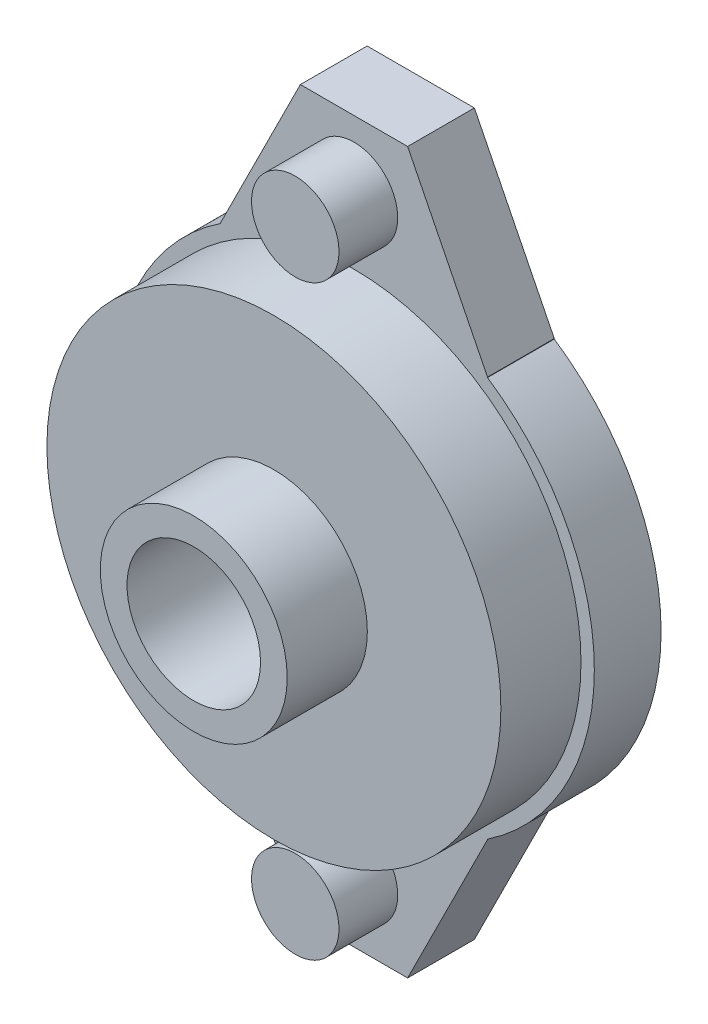
ISO-10303-21;
HEADER;
FILE_DESCRIPTION(('STEP AP214'),'2;1');
FILE_NAME('part.step','',(''),(''),'','','');
FILE_SCHEMA(('AUTOMOTIVE_DESIGN { 1 0 10303 214 1 1 1 1 }'));
ENDSEC;
DATA;
#1=APPLICATION_CONTEXT('core data for automotive mechanical design processes');
#2=APPLICATION_PROTOCOL_DEFINITION('international standard','automotive_design',2000,#1);
#3=PRODUCT_CONTEXT('',#1,'mechanical');
#4=PRODUCT('Part','Part','',(#3));
#5=PRODUCT_RELATED_PRODUCT_CATEGORY('part','',(#4));
#6=PRODUCT_DEFINITION_FORMATION('','',#4);
#7=PRODUCT_DEFINITION_CONTEXT('part definition',#1,'design');
#8=PRODUCT_DEFINITION('design','',#6,#7);
#9=PRODUCT_DEFINITION_SHAPE('','',#8);
#10=(LENGTH_UNIT() NAMED_UNIT(*) SI_UNIT(.MILLI.,.METRE.));
#11=(NAMED_UNIT(*) PLANE_ANGLE_UNIT() SI_UNIT($,.RADIAN.));
#12=(NAMED_UNIT(*) SI_UNIT($,.STERADIAN.) SOLID_ANGLE_UNIT());
#13=UNCERTAINTY_MEASURE_WITH_UNIT(LENGTH_MEASURE(1.E-05),#10,'distance_accuracy_value','');
#14=(GEOMETRIC_REPRESENTATION_CONTEXT(3) GLOBAL_UNCERTAINTY_ASSIGNED_CONTEXT((#13)) GLOBAL_UNIT_ASSIGNED_CONTEXT((#10,
#11,#12)) REPRESENTATION_CONTEXT('',''));
#15=CARTESIAN_POINT('',(0.,0.,0.));
#16=DIRECTION('',(0.,0.,1.));
#17=DIRECTION('',(1.,0.,0.));
#18=AXIS2_PLACEMENT_3D('',#15,#16,#17);
#19=CARTESIAN_POINT('',(0.,0.,-5.));
#20=DIRECTION('',(0.,0.,-1.));
#21=DIRECTION('',(-1.,0.,0.));
#22=AXIS2_PLACEMENT_3D('',#19,#20,#21);
#23=PLANE('',#22);
#24=CARTESIAN_POINT('',(0.,0.,-5.));
#25=DIRECTION('',(0.,0.,1.));
#26=DIRECTION('',(1.,0.,0.));
#27=AXIS2_PLACEMENT_3D('',#24,#25,#26);
#28=CIRCLE('',#27,5.);
#29=CARTESIAN_POINT('',(5.,0.,-5.));
#30=VERTEX_POINT('',#29);
#31=EDGE_CURVE('E293',#30,#30,#28,.T.);
#32=ORIENTED_EDGE('',*,*,#31,.T.);
#33=EDGE_LOOP('',(#32));
#34=FACE_BOUND('',#33,.T.);
#35=CARTESIAN_POINT('',(0.,0.,-5.));
#36=DIRECTION('',(0.,0.,-1.));
#37=DIRECTION('',(-1.,0.,0.));
#38=AXIS2_PLACEMENT_3D('',#35,#36,#37);
#39=CIRCLE('',#38,8.6);
#40=CARTESIAN_POINT('',(-8.6,0.,-5.));
#41=VERTEX_POINT('',#40);
#42=EDGE_CURVE('E313',#41,#41,#39,.T.);
#43=ORIENTED_EDGE('',*,*,#42,.T.);
#44=EDGE_LOOP('',(#43));
#45=FACE_BOUND('',#44,.T.);
#46=ADVANCED_FACE('F44',(#34,#45),#23,.T.);
#47=CARTESIAN_POINT('',(0.,0.,-5.));
#48=DIRECTION('',(0.,0.,-1.));
#49=DIRECTION('',(-1.,0.,0.));
#50=AXIS2_PLACEMENT_3D('',#47,#48,#49);
#51=CIRCLE('',#50,13.6);
#52=CARTESIAN_POINT('',(-13.6,0.,-5.));
#53=VERTEX_POINT('',#52);
#54=EDGE_CURVE('E305',#53,#53,#51,.T.);
#55=ORIENTED_EDGE('',*,*,#54,.F.);
#56=EDGE_LOOP('',(#55));
#57=FACE_BOUND('',#56,.T.);
#58=DIRECTION('',(1.,0.,0.));
#59=VECTOR('',#58,1.);
#60=CARTESIAN_POINT('',(10.,-26.9666295470958,-5.));
#61=LINE('',#60,#59);
#62=CARTESIAN_POINT('',(-4.01668522645211,-26.9666295470958,-5.));
#63=VERTEX_POINT('',#62);
#64=CARTESIAN_POINT('',(4.01668522645212,-26.9666295470958,-5.));
#65=VERTEX_POINT('',#64);
#66=EDGE_CURVE('E173',#63,#65,#61,.T.);
#67=ORIENTED_EDGE('',*,*,#66,.F.);
#68=DIRECTION('',(-0.447213595499958,0.894427190999916,0.));
#69=VECTOR('',#68,1.);
#70=CARTESIAN_POINT('',(-14.,-7.,-5.));
#71=LINE('',#70,#69);
#72=CARTESIAN_POINT('',(-10.,-15.,-5.));
#73=VERTEX_POINT('',#72);
#74=EDGE_CURVE('E59',#63,#73,#71,.T.);
#75=ORIENTED_EDGE('',*,*,#74,.T.);
#76=DIRECTION('',(0.,-1.,0.));
#77=VECTOR('',#76,1.);
#78=CARTESIAN_POINT('',(-10.,-26.9666295470958,-5.));
#79=LINE('',#78,#77);
#80=CARTESIAN_POINT('',(-10.,-14.9666295470958,-5.));
#81=VERTEX_POINT('',#80);
#82=EDGE_CURVE('E149',#81,#73,#79,.T.);
#83=ORIENTED_EDGE('',*,*,#82,.F.);
#84=CARTESIAN_POINT('',(0.,0.,-5.));
#85=DIRECTION('',(0.,0.,-1.));
#86=DIRECTION('',(-1.,0.,0.));
#87=AXIS2_PLACEMENT_3D('',#84,#85,#86);
#88=CIRCLE('',#87,18.);
#89=CARTESIAN_POINT('',(-10.,14.9666295470958,-5.));
#90=VERTEX_POINT('',#89);
#91=EDGE_CURVE('E239',#81,#90,#88,.T.);
#92=ORIENTED_EDGE('',*,*,#91,.T.);
#93=DIRECTION('',(0.,1.,0.));
#94=VECTOR('',#93,1.);
#95=CARTESIAN_POINT('',(-10.,26.9666295470958,-5.));
#96=LINE('',#95,#94);
#97=CARTESIAN_POINT('',(-10.,15.,-5.));
#98=VERTEX_POINT('',#97);
#99=EDGE_CURVE('E204',#90,#98,#96,.T.);
#100=ORIENTED_EDGE('',*,*,#99,.T.);
#101=DIRECTION('',(-0.447213595499958,-0.894427190999916,0.));
#102=VECTOR('',#101,1.);
#103=CARTESIAN_POINT('',(-14.,7.,-5.));
#104=LINE('',#103,#102);
#105=CARTESIAN_POINT('',(-4.01668522645211,26.9666295470958,-5.));
#106=VERTEX_POINT('',#105);
#107=EDGE_CURVE('E198',#106,#98,#104,.T.);
#108=ORIENTED_EDGE('',*,*,#107,.F.);
#109=DIRECTION('',(1.,0.,0.));
#110=VECTOR('',#109,1.);
#111=CARTESIAN_POINT('',(10.,26.9666295470958,-5.));
#112=LINE('',#111,#110);
#113=CARTESIAN_POINT('',(4.01668522645212,26.9666295470958,-5.));
#114=VERTEX_POINT('',#113);
#115=EDGE_CURVE('E221',#106,#114,#112,.T.);
#116=ORIENTED_EDGE('',*,*,#115,.T.);
#117=DIRECTION('',(-0.447213595499958,0.894427190999916,0.));
#118=VECTOR('',#117,1.);
#119=CARTESIAN_POINT('',(14.,7.,-5.));
#120=LINE('',#119,#118);
#121=CARTESIAN_POINT('',(10.,15.,-5.));
#122=VERTEX_POINT('',#121);
#123=EDGE_CURVE('E201',#122,#114,#120,.T.);
#124=ORIENTED_EDGE('',*,*,#123,.F.);
#125=DIRECTION('',(0.,-1.,0.));
#126=VECTOR('',#125,1.);
#127=CARTESIAN_POINT('',(10.,14.9666295470958,-5.));
#128=LINE('',#127,#126);
#129=CARTESIAN_POINT('',(10.,14.9666295470958,-5.));
#130=VERTEX_POINT('',#129);
#131=EDGE_CURVE('E210',#122,#130,#128,.T.);
#132=ORIENTED_EDGE('',*,*,#131,.T.);
#133=CARTESIAN_POINT('',(10.,-14.9666295470958,-5.));
#134=VERTEX_POINT('',#133);
#135=EDGE_CURVE('E234',#130,#134,#88,.T.);
#136=ORIENTED_EDGE('',*,*,#135,.T.);
#137=DIRECTION('',(0.,1.,0.));
#138=VECTOR('',#137,1.);
#139=CARTESIAN_POINT('',(10.,-14.9666295470958,-5.));
#140=LINE('',#139,#138);
#141=CARTESIAN_POINT('',(10.,-15.,-5.));
#142=VERTEX_POINT('',#141);
#143=EDGE_CURVE('E170',#142,#134,#140,.T.);
#144=ORIENTED_EDGE('',*,*,#143,.F.);
#145=DIRECTION('',(-0.447213595499958,-0.894427190999916,0.));
#146=VECTOR('',#145,1.);
#147=CARTESIAN_POINT('',(14.,-7.,-5.));
#148=LINE('',#147,#146);
#149=EDGE_CURVE('E67',#142,#65,#148,.T.);
#150=ORIENTED_EDGE('',*,*,#149,.T.);
#151=EDGE_LOOP('',(#67,#75,#83,#92,#100,#108,#116,#124,#132,#136,#144,#150));
#152=FACE_BOUND('',#151,.T.);
#153=ADVANCED_FACE('F337',(#57,#152),#23,.T.);
#154=CARTESIAN_POINT('',(0.,0.,0.));
#155=DIRECTION('',(0.,0.,-1.));
#156=DIRECTION('',(-1.,0.,0.));
#157=AXIS2_PLACEMENT_3D('',#154,#155,#156);
#158=PLANE('',#157);
#159=CARTESIAN_POINT('',(0.,-21.9666295470958,0.));
#160=DIRECTION('',(0.,0.,-1.));
#161=DIRECTION('',(1.,0.,0.));
#162=AXIS2_PLACEMENT_3D('',#159,#160,#161);
#163=CIRCLE('',#162,3.275);
#164=CARTESIAN_POINT('',(3.275,-21.9666295470958,0.));
#165=VERTEX_POINT('',#164);
#166=EDGE_CURVE('E289',#165,#165,#163,.T.);
#167=ORIENTED_EDGE('',*,*,#166,.T.);
#168=EDGE_LOOP('',(#167));
#169=FACE_BOUND('',#168,.T.);
#170=CARTESIAN_POINT('',(0.,21.9666295470958,0.));
#171=DIRECTION('',(0.,0.,-1.));
#172=DIRECTION('',(-1.,0.,0.));
#173=AXIS2_PLACEMENT_3D('',#170,#171,#172);
#174=CIRCLE('',#173,3.275);
#175=CARTESIAN_POINT('',(-3.275,21.9666295470958,0.));
#176=VERTEX_POINT('',#175);
#177=EDGE_CURVE('E265',#176,#176,#174,.F.);
#178=ORIENTED_EDGE('',*,*,#177,.F.);
#179=EDGE_LOOP('',(#178));
#180=FACE_BOUND('',#179,.T.);
#181=CARTESIAN_POINT('',(0.,0.,0.));
#182=DIRECTION('',(0.,0.,1.));
#183=DIRECTION('',(1.,0.,0.));
#184=AXIS2_PLACEMENT_3D('',#181,#182,#183);
#185=CIRCLE('',#184,17.);
#186=CARTESIAN_POINT('',(17.,0.,0.));
#187=VERTEX_POINT('',#186);
#188=EDGE_CURVE('E238',#187,#187,#185,.T.);
#189=ORIENTED_EDGE('',*,*,#188,.F.);
#190=EDGE_LOOP('',(#189));
#191=FACE_BOUND('',#190,.T.);
#192=DIRECTION('',(0.447213595499958,-0.894427190999916,0.));
#193=VECTOR('',#192,1.);
#194=CARTESIAN_POINT('',(-10.,-15.,0.));
#195=LINE('',#194,#193);
#196=CARTESIAN_POINT('',(-10.,-15.,0.));
#197=VERTEX_POINT('',#196);
#198=CARTESIAN_POINT('',(-4.01668522645212,-26.9666295470958,0.));
#199=VERTEX_POINT('',#198);
#200=EDGE_CURVE('E131',#197,#199,#195,.T.);
#201=ORIENTED_EDGE('',*,*,#200,.T.);
#202=DIRECTION('',(1.,0.,0.));
#203=VECTOR('',#202,1.);
#204=CARTESIAN_POINT('',(10.,-26.9666295470958,0.));
#205=LINE('',#204,#203);
#206=CARTESIAN_POINT('',(4.01668522645212,-26.9666295470958,0.));
#207=VERTEX_POINT('',#206);
#208=EDGE_CURVE('E159',#199,#207,#205,.T.);
#209=ORIENTED_EDGE('',*,*,#208,.T.);
#210=DIRECTION('',(0.447213595499958,0.894427190999916,0.));
#211=VECTOR('',#210,1.);
#212=CARTESIAN_POINT('',(10.,-15.,0.));
#213=LINE('',#212,#211);
#214=CARTESIAN_POINT('',(10.,-15.,0.));
#215=VERTEX_POINT('',#214);
#216=EDGE_CURVE('E140',#207,#215,#213,.T.);
#217=ORIENTED_EDGE('',*,*,#216,.T.);
#218=DIRECTION('',(0.,1.,0.));
#219=VECTOR('',#218,1.);
#220=CARTESIAN_POINT('',(10.,-14.9666295470958,0.));
#221=LINE('',#220,#219);
#222=CARTESIAN_POINT('',(10.,-14.9666295470958,0.));
#223=VERTEX_POINT('',#222);
#224=EDGE_CURVE('E166',#215,#223,#221,.T.);
#225=ORIENTED_EDGE('',*,*,#224,.T.);
#226=CARTESIAN_POINT('',(0.,0.,0.));
#227=DIRECTION('',(0.,0.,-1.));
#228=DIRECTION('',(-1.,0.,0.));
#229=AXIS2_PLACEMENT_3D('',#226,#227,#228);
#230=CIRCLE('',#229,18.);
#231=CARTESIAN_POINT('',(10.,14.9666295470958,0.));
#232=VERTEX_POINT('',#231);
#233=EDGE_CURVE('E240',#232,#223,#230,.T.);
#234=ORIENTED_EDGE('',*,*,#233,.F.);
#235=DIRECTION('',(0.,-1.,0.));
#236=VECTOR('',#235,1.);
#237=CARTESIAN_POINT('',(10.,14.9666295470958,0.));
#238=LINE('',#237,#236);
#239=CARTESIAN_POINT('',(10.,15.,0.));
#240=VERTEX_POINT('',#239);
#241=EDGE_CURVE('E214',#240,#232,#238,.T.);
#242=ORIENTED_EDGE('',*,*,#241,.F.);
#243=DIRECTION('',(0.447213595499958,-0.894427190999916,0.));
#244=VECTOR('',#243,1.);
#245=CARTESIAN_POINT('',(10.,15.,0.));
#246=LINE('',#245,#244);
#247=CARTESIAN_POINT('',(4.01668522645212,26.9666295470958,0.));
#248=VERTEX_POINT('',#247);
#249=EDGE_CURVE('E190',#248,#240,#246,.T.);
#250=ORIENTED_EDGE('',*,*,#249,.F.);
#251=DIRECTION('',(1.,0.,0.));
#252=VECTOR('',#251,1.);
#253=CARTESIAN_POINT('',(10.,26.9666295470958,0.));
#254=LINE('',#253,#252);
#255=CARTESIAN_POINT('',(-4.01668522645212,26.9666295470958,0.));
#256=VERTEX_POINT('',#255);
#257=EDGE_CURVE('E209',#256,#248,#254,.T.);
#258=ORIENTED_EDGE('',*,*,#257,.F.);
#259=DIRECTION('',(0.447213595499958,0.894427190999916,0.));
#260=VECTOR('',#259,1.);
#261=CARTESIAN_POINT('',(-10.,15.,0.));
#262=LINE('',#261,#260);
#263=CARTESIAN_POINT('',(-10.,15.,0.));
#264=VERTEX_POINT('',#263);
#265=EDGE_CURVE('E186',#264,#256,#262,.T.);
#266=ORIENTED_EDGE('',*,*,#265,.F.);
#267=DIRECTION('',(0.,1.,0.));
#268=VECTOR('',#267,1.);
#269=CARTESIAN_POINT('',(-10.,26.9666295470958,0.));
#270=LINE('',#269,#268);
#271=CARTESIAN_POINT('',(-10.,14.9666295470958,0.));
#272=VERTEX_POINT('',#271);
#273=EDGE_CURVE('E205',#272,#264,#270,.T.);
#274=ORIENTED_EDGE('',*,*,#273,.F.);
#275=CARTESIAN_POINT('',(-10.,-14.9666295470958,0.));
#276=VERTEX_POINT('',#275);
#277=EDGE_CURVE('E155',#276,#272,#230,.T.);
#278=ORIENTED_EDGE('',*,*,#277,.F.);
#279=DIRECTION('',(0.,-1.,0.));
#280=VECTOR('',#279,1.);
#281=CARTESIAN_POINT('',(-10.,-26.9666295470958,0.));
#282=LINE('',#281,#280);
#283=EDGE_CURVE('E147',#276,#197,#282,.T.);
#284=ORIENTED_EDGE('',*,*,#283,.T.);
#285=EDGE_LOOP('',(#201,#209,#217,#225,#234,#242,#250,#258,#266,#274,#278,#284));
#286=FACE_BOUND('',#285,.T.);
#287=ADVANCED_FACE('F153',(#169,#180,#191,#286),#158,.F.);
#288=CARTESIAN_POINT('',(-10.,-26.9666295470958,0.));
#289=DIRECTION('',(1.,0.,0.));
#290=DIRECTION('',(0.,0.,-1.));
#291=AXIS2_PLACEMENT_3D('',#288,#289,#290);
#292=PLANE('',#291);
#293=DIRECTION('',(0.,0.,1.));
#294=VECTOR('',#293,1.);
#295=CARTESIAN_POINT('',(-10.,-15.,-8.));
#296=LINE('',#295,#294);
#297=EDGE_CURVE('E134',#73,#197,#296,.T.);
#298=ORIENTED_EDGE('',*,*,#297,.T.);
#299=ORIENTED_EDGE('',*,*,#283,.F.);
#300=DIRECTION('',(0.,0.,-1.));
#301=VECTOR('',#300,1.);
#302=CARTESIAN_POINT('',(-10.,-14.9666295470958,0.));
#303=LINE('',#302,#301);
#304=EDGE_CURVE('E164',#276,#81,#303,.T.);
#305=ORIENTED_EDGE('',*,*,#304,.T.);
#306=ORIENTED_EDGE('',*,*,#82,.T.);
#307=EDGE_LOOP('',(#298,#299,#305,#306));
#308=FACE_BOUND('',#307,.T.);
#309=ADVANCED_FACE('F145',(#308),#292,.F.);
#310=CARTESIAN_POINT('',(10.,-26.9666295470958,0.));
#311=DIRECTION('',(0.,1.,0.));
#312=DIRECTION('',(0.,0.,1.));
#313=AXIS2_PLACEMENT_3D('',#310,#311,#312);
#314=PLANE('',#313);
#315=DIRECTION('',(0.,0.,1.));
#316=VECTOR('',#315,1.);
#317=CARTESIAN_POINT('',(-4.01668522645211,-26.9666295470958,0.));
#318=LINE('',#317,#316);
#319=EDGE_CURVE('E11',#63,#199,#318,.T.);
#320=ORIENTED_EDGE('',*,*,#319,.F.);
#321=ORIENTED_EDGE('',*,*,#66,.T.);
#322=DIRECTION('',(0.,0.,-1.));
#323=VECTOR('',#322,1.);
#324=CARTESIAN_POINT('',(4.01668522645212,-26.9666295470958,0.));
#325=LINE('',#324,#323);
#326=EDGE_CURVE('E151',#207,#65,#325,.T.);
#327=ORIENTED_EDGE('',*,*,#326,.F.);
#328=ORIENTED_EDGE('',*,*,#208,.F.);
#329=EDGE_LOOP('',(#320,#321,#327,#328));
#330=FACE_BOUND('',#329,.T.);
#331=ADVANCED_FACE('F343',(#330),#314,.F.);
#332=CARTESIAN_POINT('',(10.,-14.9666295470958,0.));
#333=DIRECTION('',(-1.,0.,0.));
#334=DIRECTION('',(0.,0.,1.));
#335=AXIS2_PLACEMENT_3D('',#332,#333,#334);
#336=PLANE('',#335);
#337=DIRECTION('',(0.,0.,1.));
#338=VECTOR('',#337,1.);
#339=CARTESIAN_POINT('',(10.,-15.,0.));
#340=LINE('',#339,#338);
#341=EDGE_CURVE('E53',#142,#215,#340,.T.);
#342=ORIENTED_EDGE('',*,*,#341,.F.);
#343=ORIENTED_EDGE('',*,*,#143,.T.);
#344=DIRECTION('',(0.,0.,-1.));
#345=VECTOR('',#344,1.);
#346=CARTESIAN_POINT('',(10.,-14.9666295470958,0.));
#347=LINE('',#346,#345);
#348=EDGE_CURVE('E158',#223,#134,#347,.T.);
#349=ORIENTED_EDGE('',*,*,#348,.F.);
#350=ORIENTED_EDGE('',*,*,#224,.F.);
#351=EDGE_LOOP('',(#342,#343,#349,#350));
#352=FACE_BOUND('',#351,.T.);
#353=ADVANCED_FACE('F280',(#352),#336,.F.);
#354=CARTESIAN_POINT('',(0.,0.,-5.));
#355=DIRECTION('',(0.,0.,1.));
#356=DIRECTION('',(1.,0.,0.));
#357=AXIS2_PLACEMENT_3D('',#354,#355,#356);
#358=CYLINDRICAL_SURFACE('',#357,18.);
#359=ORIENTED_EDGE('',*,*,#304,.F.);
#360=ORIENTED_EDGE('',*,*,#277,.T.);
#361=DIRECTION('',(0.,0.,-1.));
#362=VECTOR('',#361,1.);
#363=CARTESIAN_POINT('',(-10.,14.9666295470958,0.));
#364=LINE('',#363,#362);
#365=EDGE_CURVE('E217',#272,#90,#364,.T.);
#366=ORIENTED_EDGE('',*,*,#365,.T.);
#367=ORIENTED_EDGE('',*,*,#91,.F.);
#368=EDGE_LOOP('',(#359,#360,#366,#367));
#369=FACE_BOUND('',#368,.T.);
#370=ADVANCED_FACE('F350',(#369),#358,.T.);
#371=ORIENTED_EDGE('',*,*,#348,.T.);
#372=ORIENTED_EDGE('',*,*,#135,.F.);
#373=DIRECTION('',(0.,0.,-1.));
#374=VECTOR('',#373,1.);
#375=CARTESIAN_POINT('',(10.,14.9666295470958,0.));
#376=LINE('',#375,#374);
#377=EDGE_CURVE('E227',#232,#130,#376,.T.);
#378=ORIENTED_EDGE('',*,*,#377,.F.);
#379=ORIENTED_EDGE('',*,*,#233,.T.);
#380=EDGE_LOOP('',(#371,#372,#378,#379));
#381=FACE_BOUND('',#380,.T.);
#382=ADVANCED_FACE('F367',(#381),#358,.T.);
#383=CARTESIAN_POINT('',(0.,0.,6.));
#384=DIRECTION('',(0.,0.,-1.));
#385=DIRECTION('',(-1.,0.,0.));
#386=AXIS2_PLACEMENT_3D('',#383,#384,#385);
#387=CYLINDRICAL_SURFACE('',#386,17.);
#388=CARTESIAN_POINT('',(0.,0.,6.));
#389=DIRECTION('',(0.,0.,1.));
#390=DIRECTION('',(1.,0.,0.));
#391=AXIS2_PLACEMENT_3D('',#388,#389,#390);
#392=CIRCLE('',#391,17.);
#393=CARTESIAN_POINT('',(17.,0.,6.));
#394=VERTEX_POINT('',#393);
#395=EDGE_CURVE('E248',#394,#394,#392,.T.);
#396=ORIENTED_EDGE('',*,*,#395,.F.);
#397=EDGE_LOOP('',(#396));
#398=FACE_BOUND('',#397,.T.);
#399=ORIENTED_EDGE('',*,*,#188,.T.);
#400=EDGE_LOOP('',(#399));
#401=FACE_BOUND('',#400,.T.);
#402=ADVANCED_FACE('F46',(#398,#401),#387,.T.);
#403=CARTESIAN_POINT('',(0.,0.,6.));
#404=DIRECTION('',(0.,0.,1.));
#405=DIRECTION('',(1.,0.,0.));
#406=AXIS2_PLACEMENT_3D('',#403,#404,#405);
#407=PLANE('',#406);
#408=CARTESIAN_POINT('',(0.,0.,6.));
#409=DIRECTION('',(0.,0.,1.));
#410=DIRECTION('',(1.,0.,0.));
#411=AXIS2_PLACEMENT_3D('',#408,#409,#410);
#412=CIRCLE('',#411,7.);
#413=CARTESIAN_POINT('',(7.,0.,6.));
#414=VERTEX_POINT('',#413);
#415=EDGE_CURVE('E249',#414,#414,#412,.T.);
#416=ORIENTED_EDGE('',*,*,#415,.F.);
#417=EDGE_LOOP('',(#416));
#418=FACE_BOUND('',#417,.T.);
#419=ORIENTED_EDGE('',*,*,#395,.T.);
#420=EDGE_LOOP('',(#419));
#421=FACE_BOUND('',#420,.T.);
#422=ADVANCED_FACE('F376',(#418,#421),#407,.T.);
#423=CARTESIAN_POINT('',(0.,0.,12.));
#424=DIRECTION('',(0.,0.,-1.));
#425=DIRECTION('',(-1.,0.,0.));
#426=AXIS2_PLACEMENT_3D('',#423,#424,#425);
#427=CYLINDRICAL_SURFACE('',#426,7.);
#428=CARTESIAN_POINT('',(0.,0.,12.));
#429=DIRECTION('',(0.,0.,1.));
#430=DIRECTION('',(1.,0.,0.));
#431=AXIS2_PLACEMENT_3D('',#428,#429,#430);
#432=CIRCLE('',#431,7.);
#433=CARTESIAN_POINT('',(7.,0.,12.));
#434=VERTEX_POINT('',#433);
#435=EDGE_CURVE('E244',#434,#434,#432,.T.);
#436=ORIENTED_EDGE('',*,*,#435,.F.);
#437=EDGE_LOOP('',(#436));
#438=FACE_BOUND('',#437,.T.);
#439=ORIENTED_EDGE('',*,*,#415,.T.);
#440=EDGE_LOOP('',(#439));
#441=FACE_BOUND('',#440,.T.);
#442=ADVANCED_FACE('F373',(#438,#441),#427,.T.);
#443=CARTESIAN_POINT('',(0.,0.,12.));
#444=DIRECTION('',(0.,0.,1.));
#445=DIRECTION('',(1.,0.,0.));
#446=AXIS2_PLACEMENT_3D('',#443,#444,#445);
#447=PLANE('',#446);
#448=CARTESIAN_POINT('',(0.,0.,12.));
#449=DIRECTION('',(0.,0.,1.));
#450=DIRECTION('',(1.,0.,0.));
#451=AXIS2_PLACEMENT_3D('',#448,#449,#450);
#452=CIRCLE('',#451,5.);
#453=CARTESIAN_POINT('',(5.,0.,12.));
#454=VERTEX_POINT('',#453);
#455=EDGE_CURVE('E297',#454,#454,#452,.T.);
#456=ORIENTED_EDGE('',*,*,#455,.F.);
#457=EDGE_LOOP('',(#456));
#458=FACE_BOUND('',#457,.T.);
#459=ORIENTED_EDGE('',*,*,#435,.T.);
#460=EDGE_LOOP('',(#459));
#461=FACE_BOUND('',#460,.T.);
#462=ADVANCED_FACE('F369',(#458,#461),#447,.T.);
#463=CARTESIAN_POINT('',(10.,14.9666295470958,0.));
#464=DIRECTION('',(1.,0.,0.));
#465=DIRECTION('',(0.,0.,-1.));
#466=AXIS2_PLACEMENT_3D('',#463,#464,#465);
#467=PLANE('',#466);
#468=DIRECTION('',(0.,0.,1.));
#469=VECTOR('',#468,1.);
#470=CARTESIAN_POINT('',(10.,15.,-8.));
#471=LINE('',#470,#469);
#472=EDGE_CURVE('E185',#122,#240,#471,.T.);
#473=ORIENTED_EDGE('',*,*,#472,.T.);
#474=ORIENTED_EDGE('',*,*,#241,.T.);
#475=ORIENTED_EDGE('',*,*,#377,.T.);
#476=ORIENTED_EDGE('',*,*,#131,.F.);
#477=EDGE_LOOP('',(#473,#474,#475,#476));
#478=FACE_BOUND('',#477,.T.);
#479=ADVANCED_FACE('F372',(#478),#467,.T.);
#480=CARTESIAN_POINT('',(10.,26.9666295470958,0.));
#481=DIRECTION('',(0.,1.,0.));
#482=DIRECTION('',(0.,0.,1.));
#483=AXIS2_PLACEMENT_3D('',#480,#481,#482);
#484=PLANE('',#483);
#485=DIRECTION('',(0.,0.,-1.));
#486=VECTOR('',#485,1.);
#487=CARTESIAN_POINT('',(-4.01668522645211,26.9666295470958,0.));
#488=LINE('',#487,#486);
#489=EDGE_CURVE('E189',#256,#106,#488,.T.);
#490=ORIENTED_EDGE('',*,*,#489,.F.);
#491=ORIENTED_EDGE('',*,*,#257,.T.);
#492=DIRECTION('',(0.,0.,1.));
#493=VECTOR('',#492,1.);
#494=CARTESIAN_POINT('',(4.01668522645212,26.9666295470958,0.));
#495=LINE('',#494,#493);
#496=EDGE_CURVE('E262',#114,#248,#495,.T.);
#497=ORIENTED_EDGE('',*,*,#496,.F.);
#498=ORIENTED_EDGE('',*,*,#115,.F.);
#499=EDGE_LOOP('',(#490,#491,#497,#498));
#500=FACE_BOUND('',#499,.T.);
#501=ADVANCED_FACE('F410',(#500),#484,.T.);
#502=CARTESIAN_POINT('',(-10.,26.9666295470958,0.));
#503=DIRECTION('',(-1.,0.,0.));
#504=DIRECTION('',(0.,0.,1.));
#505=AXIS2_PLACEMENT_3D('',#502,#503,#504);
#506=PLANE('',#505);
#507=DIRECTION('',(0.,0.,1.));
#508=VECTOR('',#507,1.);
#509=CARTESIAN_POINT('',(-10.,15.,0.));
#510=LINE('',#509,#508);
#511=EDGE_CURVE('E253',#98,#264,#510,.T.);
#512=ORIENTED_EDGE('',*,*,#511,.F.);
#513=ORIENTED_EDGE('',*,*,#99,.F.);
#514=ORIENTED_EDGE('',*,*,#365,.F.);
#515=ORIENTED_EDGE('',*,*,#273,.T.);
#516=EDGE_LOOP('',(#512,#513,#514,#515));
#517=FACE_BOUND('',#516,.T.);
#518=ADVANCED_FACE('F360',(#517),#506,.T.);
#519=CARTESIAN_POINT('',(-10.,15.,-8.));
#520=DIRECTION('',(0.894427190999916,-0.447213595499958,0.));
#521=DIRECTION('',(0.447213595499958,0.894427190999916,0.));
#522=AXIS2_PLACEMENT_3D('',#519,#520,#521);
#523=PLANE('',#522);
#524=ORIENTED_EDGE('',*,*,#107,.T.);
#525=ORIENTED_EDGE('',*,*,#511,.T.);
#526=ORIENTED_EDGE('',*,*,#265,.T.);
#527=ORIENTED_EDGE('',*,*,#489,.T.);
#528=EDGE_LOOP('',(#524,#525,#526,#527));
#529=FACE_BOUND('',#528,.T.);
#530=ADVANCED_FACE('F414',(#529),#523,.F.);
#531=CARTESIAN_POINT('',(10.,15.,-8.));
#532=DIRECTION('',(-0.894427190999916,-0.447213595499958,0.));
#533=DIRECTION('',(0.447213595499958,-0.894427190999916,0.));
#534=AXIS2_PLACEMENT_3D('',#531,#532,#533);
#535=PLANE('',#534);
#536=ORIENTED_EDGE('',*,*,#123,.T.);
#537=ORIENTED_EDGE('',*,*,#496,.T.);
#538=ORIENTED_EDGE('',*,*,#249,.T.);
#539=ORIENTED_EDGE('',*,*,#472,.F.);
#540=EDGE_LOOP('',(#536,#537,#538,#539));
#541=FACE_BOUND('',#540,.T.);
#542=ADVANCED_FACE('F426',(#541),#535,.F.);
#543=CARTESIAN_POINT('',(0.,21.9666295470958,4.4));
#544=DIRECTION('',(0.,0.,-1.));
#545=DIRECTION('',(-1.,0.,0.));
#546=AXIS2_PLACEMENT_3D('',#543,#544,#545);
#547=CYLINDRICAL_SURFACE('',#546,3.275);
#548=CARTESIAN_POINT('',(0.,21.9666295470958,4.4));
#549=DIRECTION('',(0.,0.,1.));
#550=DIRECTION('',(1.,0.,0.));
#551=AXIS2_PLACEMENT_3D('',#548,#549,#550);
#552=CIRCLE('',#551,3.275);
#553=CARTESIAN_POINT('',(3.275,21.9666295470958,4.4));
#554=VERTEX_POINT('',#553);
#555=EDGE_CURVE('E180',#554,#554,#552,.T.);
#556=ORIENTED_EDGE('',*,*,#555,.F.);
#557=EDGE_LOOP('',(#556));
#558=FACE_BOUND('',#557,.T.);
#559=ORIENTED_EDGE('',*,*,#177,.T.);
#560=EDGE_LOOP('',(#559));
#561=FACE_BOUND('',#560,.T.);
#562=ADVANCED_FACE('F434',(#558,#561),#547,.T.);
#563=CARTESIAN_POINT('',(0.,21.9666295470958,4.4));
#564=DIRECTION('',(0.,0.,1.));
#565=DIRECTION('',(1.,0.,0.));
#566=AXIS2_PLACEMENT_3D('',#563,#564,#565);
#567=PLANE('',#566);
#568=ORIENTED_EDGE('',*,*,#555,.T.);
#569=EDGE_LOOP('',(#568));
#570=FACE_BOUND('',#569,.T.);
#571=ADVANCED_FACE('F438',(#570),#567,.T.);
#572=CARTESIAN_POINT('',(10.,-15.,-8.));
#573=DIRECTION('',(0.894427190999916,-0.447213595499958,0.));
#574=DIRECTION('',(0.447213595499958,0.894427190999916,0.));
#575=AXIS2_PLACEMENT_3D('',#572,#573,#574);
#576=PLANE('',#575);
#577=ORIENTED_EDGE('',*,*,#341,.T.);
#578=ORIENTED_EDGE('',*,*,#216,.F.);
#579=ORIENTED_EDGE('',*,*,#326,.T.);
#580=ORIENTED_EDGE('',*,*,#149,.F.);
#581=EDGE_LOOP('',(#577,#578,#579,#580));
#582=FACE_BOUND('',#581,.T.);
#583=ADVANCED_FACE('F270',(#582),#576,.T.);
#584=CARTESIAN_POINT('',(-10.,-15.,-8.));
#585=DIRECTION('',(-0.894427190999916,-0.447213595499958,0.));
#586=DIRECTION('',(0.447213595499958,-0.894427190999916,0.));
#587=AXIS2_PLACEMENT_3D('',#584,#585,#586);
#588=PLANE('',#587);
#589=ORIENTED_EDGE('',*,*,#319,.T.);
#590=ORIENTED_EDGE('',*,*,#200,.F.);
#591=ORIENTED_EDGE('',*,*,#297,.F.);
#592=ORIENTED_EDGE('',*,*,#74,.F.);
#593=EDGE_LOOP('',(#589,#590,#591,#592));
#594=FACE_BOUND('',#593,.T.);
#595=ADVANCED_FACE('F133',(#594),#588,.T.);
#596=CARTESIAN_POINT('',(0.,-21.9666295470958,4.4));
#597=DIRECTION('',(0.,0.,-1.));
#598=DIRECTION('',(-1.,0.,0.));
#599=AXIS2_PLACEMENT_3D('',#596,#597,#598);
#600=CYLINDRICAL_SURFACE('',#599,3.275);
#601=CARTESIAN_POINT('',(0.,-21.9666295470958,4.4));
#602=DIRECTION('',(0.,0.,-1.));
#603=DIRECTION('',(1.,0.,0.));
#604=AXIS2_PLACEMENT_3D('',#601,#602,#603);
#605=CIRCLE('',#604,3.275);
#606=CARTESIAN_POINT('',(3.275,-21.9666295470958,4.4));
#607=VERTEX_POINT('',#606);
#608=EDGE_CURVE('E277',#607,#607,#605,.T.);
#609=ORIENTED_EDGE('',*,*,#608,.T.);
#610=EDGE_LOOP('',(#609));
#611=FACE_BOUND('',#610,.T.);
#612=ORIENTED_EDGE('',*,*,#166,.F.);
#613=EDGE_LOOP('',(#612));
#614=FACE_BOUND('',#613,.T.);
#615=ADVANCED_FACE('F453',(#611,#614),#600,.T.);
#616=CARTESIAN_POINT('',(0.,-21.9666295470958,4.4));
#617=DIRECTION('',(0.,0.,1.));
#618=DIRECTION('',(1.,0.,0.));
#619=AXIS2_PLACEMENT_3D('',#616,#617,#618);
#620=PLANE('',#619);
#621=ORIENTED_EDGE('',*,*,#608,.F.);
#622=EDGE_LOOP('',(#621));
#623=FACE_BOUND('',#622,.T.);
#624=ADVANCED_FACE('F458',(#623),#620,.T.);
#625=CARTESIAN_POINT('',(0.,0.,-5.));
#626=DIRECTION('',(0.,0.,1.));
#627=DIRECTION('',(1.,0.,0.));
#628=AXIS2_PLACEMENT_3D('',#625,#626,#627);
#629=CYLINDRICAL_SURFACE('',#628,5.);
#630=ORIENTED_EDGE('',*,*,#31,.F.);
#631=EDGE_LOOP('',(#630));
#632=FACE_BOUND('',#631,.T.);
#633=ORIENTED_EDGE('',*,*,#455,.T.);
#634=EDGE_LOOP('',(#633));
#635=FACE_BOUND('',#634,.T.);
#636=ADVANCED_FACE('F333',(#632,#635),#629,.F.);
#637=CARTESIAN_POINT('',(0.,0.,-2.));
#638=DIRECTION('',(0.,0.,-1.));
#639=DIRECTION('',(-1.,0.,0.));
#640=AXIS2_PLACEMENT_3D('',#637,#638,#639);
#641=CYLINDRICAL_SURFACE('',#640,13.6);
#642=CARTESIAN_POINT('',(0.,0.,-2.));
#643=DIRECTION('',(0.,0.,-1.));
#644=DIRECTION('',(-1.,0.,0.));
#645=AXIS2_PLACEMENT_3D('',#642,#643,#644);
#646=CIRCLE('',#645,13.6);
#647=CARTESIAN_POINT('',(-13.6,0.,-2.));
#648=VERTEX_POINT('',#647);
#649=EDGE_CURVE('E301',#648,#648,#646,.T.);
#650=ORIENTED_EDGE('',*,*,#649,.F.);
#651=EDGE_LOOP('',(#650));
#652=FACE_BOUND('',#651,.T.);
#653=ORIENTED_EDGE('',*,*,#54,.T.);
#654=EDGE_LOOP('',(#653));
#655=FACE_BOUND('',#654,.T.);
#656=ADVANCED_FACE('F327',(#652,#655),#641,.F.);
#657=CARTESIAN_POINT('',(0.,0.,-2.));
#658=DIRECTION('',(0.,0.,-1.));
#659=DIRECTION('',(-1.,0.,0.));
#660=AXIS2_PLACEMENT_3D('',#657,#658,#659);
#661=PLANE('',#660);
#662=CARTESIAN_POINT('',(0.,0.,-2.));
#663=DIRECTION('',(0.,0.,-1.));
#664=DIRECTION('',(-1.,0.,0.));
#665=AXIS2_PLACEMENT_3D('',#662,#663,#664);
#666=CIRCLE('',#665,8.6);
#667=CARTESIAN_POINT('',(-8.6,0.,-2.));
#668=VERTEX_POINT('',#667);
#669=EDGE_CURVE('E309',#668,#668,#666,.T.);
#670=ORIENTED_EDGE('',*,*,#669,.F.);
#671=EDGE_LOOP('',(#670));
#672=FACE_BOUND('',#671,.T.);
#673=ORIENTED_EDGE('',*,*,#649,.T.);
#674=EDGE_LOOP('',(#673));
#675=FACE_BOUND('',#674,.T.);
#676=ADVANCED_FACE('F324',(#672,#675),#661,.T.);
#677=CARTESIAN_POINT('',(0.,0.,-2.));
#678=DIRECTION('',(0.,0.,-1.));
#679=DIRECTION('',(-1.,0.,0.));
#680=AXIS2_PLACEMENT_3D('',#677,#678,#679);
#681=CYLINDRICAL_SURFACE('',#680,8.6);
#682=ORIENTED_EDGE('',*,*,#669,.T.);
#683=EDGE_LOOP('',(#682));
#684=FACE_BOUND('',#683,.T.);
#685=ORIENTED_EDGE('',*,*,#42,.F.);
#686=EDGE_LOOP('',(#685));
#687=FACE_BOUND('',#686,.T.);
#688=ADVANCED_FACE('F321',(#684,#687),#681,.T.);
#689=CLOSED_SHELL('',(#46,#153,#287,#309,#331,#353,#370,#382,#402,#422,#442,#462,#479,#501,#518,
#530,#542,#562,#571,#583,#595,#615,#624,#636,#656,#676,#688));
#690=MANIFOLD_SOLID_BREP('B2',#689);
#691=ADVANCED_BREP_SHAPE_REPRESENTATION('',(#18,#690),#14);
#692=SHAPE_DEFINITION_REPRESENTATION(#9,#691);
ENDSEC;
END-ISO-10303-21;
